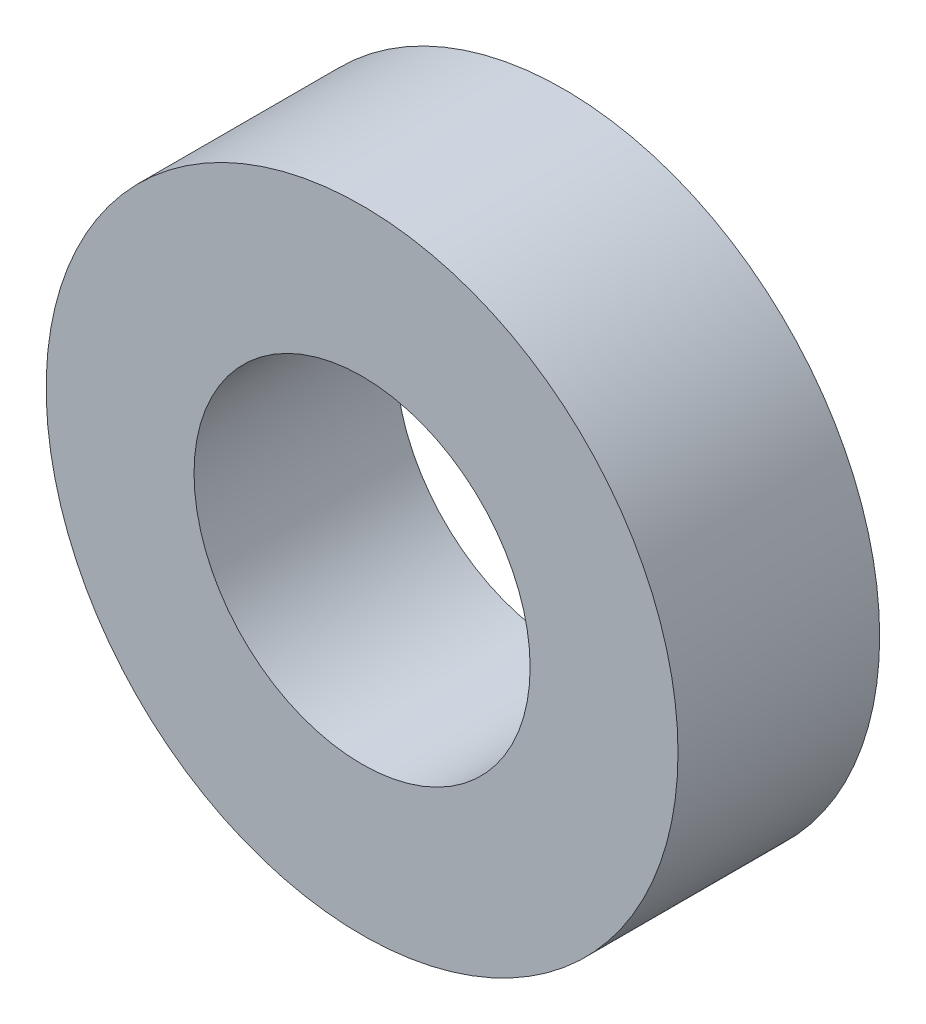
ISO-10303-21;
HEADER;
FILE_DESCRIPTION(('STEP AP214'),'2;1');
FILE_NAME('part.step','',(''),(''),'','','');
FILE_SCHEMA(('AUTOMOTIVE_DESIGN { 1 0 10303 214 1 1 1 1 }'));
ENDSEC;
DATA;
#1=APPLICATION_CONTEXT('core data for automotive mechanical design processes');
#2=APPLICATION_PROTOCOL_DEFINITION('international standard','automotive_design',2000,#1);
#3=PRODUCT_CONTEXT('',#1,'mechanical');
#4=PRODUCT('Part','Part','',(#3));
#5=PRODUCT_RELATED_PRODUCT_CATEGORY('part','',(#4));
#6=PRODUCT_DEFINITION_FORMATION('','',#4);
#7=PRODUCT_DEFINITION_CONTEXT('part definition',#1,'design');
#8=PRODUCT_DEFINITION('design','',#6,#7);
#9=PRODUCT_DEFINITION_SHAPE('','',#8);
#10=(LENGTH_UNIT() NAMED_UNIT(*) SI_UNIT(.MILLI.,.METRE.));
#11=(NAMED_UNIT(*) PLANE_ANGLE_UNIT() SI_UNIT($,.RADIAN.));
#12=(NAMED_UNIT(*) SI_UNIT($,.STERADIAN.) SOLID_ANGLE_UNIT());
#13=UNCERTAINTY_MEASURE_WITH_UNIT(LENGTH_MEASURE(1.E-05),#10,'distance_accuracy_value','');
#14=(GEOMETRIC_REPRESENTATION_CONTEXT(3) GLOBAL_UNCERTAINTY_ASSIGNED_CONTEXT((#13)) GLOBAL_UNIT_ASSIGNED_CONTEXT((#10,
#11,#12)) REPRESENTATION_CONTEXT('',''));
#15=CARTESIAN_POINT('',(0.,0.,0.));
#16=DIRECTION('',(0.,0.,1.));
#17=DIRECTION('',(1.,0.,0.));
#18=AXIS2_PLACEMENT_3D('',#15,#16,#17);
#19=CARTESIAN_POINT('',(0.,0.,15.));
#20=DIRECTION('',(0.,0.,1.));
#21=DIRECTION('',(1.,0.,0.));
#22=AXIS2_PLACEMENT_3D('',#19,#20,#21);
#23=PLANE('',#22);
#24=CARTESIAN_POINT('',(0.,0.,15.));
#25=DIRECTION('',(0.,0.,1.));
#26=DIRECTION('',(1.,0.,0.));
#27=AXIS2_PLACEMENT_3D('',#24,#25,#26);
#28=CIRCLE('',#27,23.5);
#29=CARTESIAN_POINT('',(23.5,0.,15.));
#30=VERTEX_POINT('',#29);
#31=EDGE_CURVE('E10',#30,#30,#28,.T.);
#32=ORIENTED_EDGE('',*,*,#31,.T.);
#33=EDGE_LOOP('',(#32));
#34=FACE_BOUND('',#33,.T.);
#35=CARTESIAN_POINT('',(0.,0.,15.));
#36=DIRECTION('',(0.,0.,1.));
#37=DIRECTION('',(1.,0.,0.));
#38=AXIS2_PLACEMENT_3D('',#35,#36,#37);
#39=CIRCLE('',#38,12.5);
#40=CARTESIAN_POINT('',(12.5,0.,15.));
#41=VERTEX_POINT('',#40);
#42=EDGE_CURVE('E58',#41,#41,#39,.T.);
#43=ORIENTED_EDGE('',*,*,#42,.F.);
#44=EDGE_LOOP('',(#43));
#45=FACE_BOUND('',#44,.T.);
#46=ADVANCED_FACE('F45',(#34,#45),#23,.T.);
#47=CARTESIAN_POINT('',(0.,0.,0.));
#48=DIRECTION('',(0.,0.,1.));
#49=DIRECTION('',(1.,0.,0.));
#50=AXIS2_PLACEMENT_3D('',#47,#48,#49);
#51=PLANE('',#50);
#52=CARTESIAN_POINT('',(0.,0.,0.));
#53=DIRECTION('',(0.,0.,1.));
#54=DIRECTION('',(1.,0.,0.));
#55=AXIS2_PLACEMENT_3D('',#52,#53,#54);
#56=CIRCLE('',#55,23.5);
#57=CARTESIAN_POINT('',(23.5,0.,0.));
#58=VERTEX_POINT('',#57);
#59=EDGE_CURVE('E49',#58,#58,#56,.T.);
#60=ORIENTED_EDGE('',*,*,#59,.F.);
#61=EDGE_LOOP('',(#60));
#62=FACE_BOUND('',#61,.T.);
#63=CARTESIAN_POINT('',(0.,0.,0.));
#64=DIRECTION('',(0.,0.,1.));
#65=DIRECTION('',(1.,0.,0.));
#66=AXIS2_PLACEMENT_3D('',#63,#64,#65);
#67=CIRCLE('',#66,12.5);
#68=CARTESIAN_POINT('',(12.5,0.,0.));
#69=VERTEX_POINT('',#68);
#70=EDGE_CURVE('E60',#69,#69,#67,.T.);
#71=ORIENTED_EDGE('',*,*,#70,.T.);
#72=EDGE_LOOP('',(#71));
#73=FACE_BOUND('',#72,.T.);
#74=ADVANCED_FACE('F72',(#62,#73),#51,.F.);
#75=CARTESIAN_POINT('',(0.,0.,15.));
#76=DIRECTION('',(0.,0.,-1.));
#77=DIRECTION('',(-1.,0.,0.));
#78=AXIS2_PLACEMENT_3D('',#75,#76,#77);
#79=CYLINDRICAL_SURFACE('',#78,23.5);
#80=ORIENTED_EDGE('',*,*,#31,.F.);
#81=EDGE_LOOP('',(#80));
#82=FACE_BOUND('',#81,.T.);
#83=ORIENTED_EDGE('',*,*,#59,.T.);
#84=EDGE_LOOP('',(#83));
#85=FACE_BOUND('',#84,.T.);
#86=ADVANCED_FACE('F47',(#82,#85),#79,.T.);
#87=CARTESIAN_POINT('',(0.,0.,15.));
#88=DIRECTION('',(0.,0.,-1.));
#89=DIRECTION('',(-1.,0.,0.));
#90=AXIS2_PLACEMENT_3D('',#87,#88,#89);
#91=CYLINDRICAL_SURFACE('',#90,12.5);
#92=ORIENTED_EDGE('',*,*,#42,.T.);
#93=EDGE_LOOP('',(#92));
#94=FACE_BOUND('',#93,.T.);
#95=ORIENTED_EDGE('',*,*,#70,.F.);
#96=EDGE_LOOP('',(#95));
#97=FACE_BOUND('',#96,.T.);
#98=ADVANCED_FACE('F68',(#94,#97),#91,.F.);
#99=CLOSED_SHELL('',(#46,#74,#86,#98));
#100=MANIFOLD_SOLID_BREP('B2',#99);
#101=ADVANCED_BREP_SHAPE_REPRESENTATION('',(#18,#100),#14);
#102=SHAPE_DEFINITION_REPRESENTATION(#9,#101);
ENDSEC;
END-ISO-10303-21;
